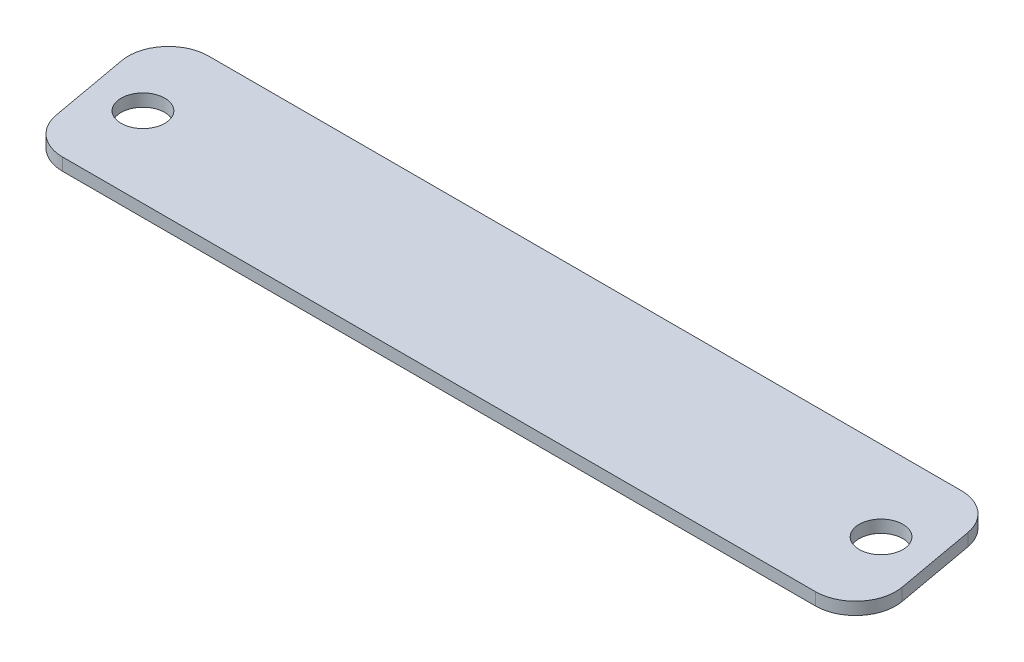
ISO-10303-21;
HEADER;
FILE_DESCRIPTION(('STEP AP214'),'2;1');
FILE_NAME('part.step','',(''),(''),'','','');
FILE_SCHEMA(('AUTOMOTIVE_DESIGN { 1 0 10303 214 1 1 1 1 }'));
ENDSEC;
DATA;
#1=APPLICATION_CONTEXT('core data for automotive mechanical design processes');
#2=APPLICATION_PROTOCOL_DEFINITION('international standard','automotive_design',2000,#1);
#3=PRODUCT_CONTEXT('',#1,'mechanical');
#4=PRODUCT('Part','Part','',(#3));
#5=PRODUCT_RELATED_PRODUCT_CATEGORY('part','',(#4));
#6=PRODUCT_DEFINITION_FORMATION('','',#4);
#7=PRODUCT_DEFINITION_CONTEXT('part definition',#1,'design');
#8=PRODUCT_DEFINITION('design','',#6,#7);
#9=PRODUCT_DEFINITION_SHAPE('','',#8);
#10=(LENGTH_UNIT() NAMED_UNIT(*) SI_UNIT(.MILLI.,.METRE.));
#11=(NAMED_UNIT(*) PLANE_ANGLE_UNIT() SI_UNIT($,.RADIAN.));
#12=(NAMED_UNIT(*) SI_UNIT($,.STERADIAN.) SOLID_ANGLE_UNIT());
#13=UNCERTAINTY_MEASURE_WITH_UNIT(LENGTH_MEASURE(1.E-05),#10,'distance_accuracy_value','');
#14=(GEOMETRIC_REPRESENTATION_CONTEXT(3) GLOBAL_UNCERTAINTY_ASSIGNED_CONTEXT((#13)) GLOBAL_UNIT_ASSIGNED_CONTEXT((#10,
#11,#12)) REPRESENTATION_CONTEXT('',''));
#15=CARTESIAN_POINT('',(0.,0.,0.));
#16=DIRECTION('',(0.,0.,1.));
#17=DIRECTION('',(1.,0.,0.));
#18=AXIS2_PLACEMENT_3D('',#15,#16,#17);
#19=CARTESIAN_POINT('',(0.,-0.7874,-10.16));
#20=DIRECTION('',(0.,0.,-1.));
#21=DIRECTION('',(-1.,0.,0.));
#22=AXIS2_PLACEMENT_3D('',#19,#20,#21);
#23=PLANE('',#22);
#24=DIRECTION('',(-1.,0.,0.));
#25=VECTOR('',#24,1.);
#26=CARTESIAN_POINT('',(0.,-0.7874,-10.16));
#27=LINE('',#26,#25);
#28=CARTESIAN_POINT('',(52.8025370439333,-0.7874,-10.16));
#29=VERTEX_POINT('',#28);
#30=CARTESIAN_POINT('',(5.12509129932392,-0.7874,-10.16));
#31=VERTEX_POINT('',#30);
#32=EDGE_CURVE('E113',#29,#31,#27,.T.);
#33=ORIENTED_EDGE('',*,*,#32,.T.);
#34=DIRECTION('',(0.,-1.,0.));
#35=VECTOR('',#34,1.);
#36=CARTESIAN_POINT('',(5.12509129932392,-0.7874,-10.16));
#37=LINE('',#36,#35);
#38=CARTESIAN_POINT('',(5.12509129932392,0.,-10.16));
#39=VERTEX_POINT('',#38);
#40=EDGE_CURVE('E126',#31,#39,#37,.F.);
#41=ORIENTED_EDGE('',*,*,#40,.T.);
#42=DIRECTION('',(-1.,0.,0.));
#43=VECTOR('',#42,1.);
#44=CARTESIAN_POINT('',(0.,0.,-10.16));
#45=LINE('',#44,#43);
#46=CARTESIAN_POINT('',(52.8025370439333,0.,-10.16));
#47=VERTEX_POINT('',#46);
#48=EDGE_CURVE('E138',#47,#39,#45,.T.);
#49=ORIENTED_EDGE('',*,*,#48,.F.);
#50=DIRECTION('',(0.,-1.,0.));
#51=VECTOR('',#50,1.);
#52=CARTESIAN_POINT('',(52.8025370439333,-0.7874,-10.16));
#53=LINE('',#52,#51);
#54=EDGE_CURVE('E128',#47,#29,#53,.T.);
#55=ORIENTED_EDGE('',*,*,#54,.T.);
#56=EDGE_LOOP('',(#33,#41,#49,#55));
#57=FACE_BOUND('',#56,.T.);
#58=ADVANCED_FACE('F35',(#57),#23,.T.);
#59=CARTESIAN_POINT('',(0.,-0.7874,0.));
#60=DIRECTION('',(0.,0.,1.));
#61=DIRECTION('',(1.,0.,0.));
#62=AXIS2_PLACEMENT_3D('',#59,#60,#61);
#63=PLANE('',#62);
#64=DIRECTION('',(1.,0.,0.));
#65=VECTOR('',#64,1.);
#66=CARTESIAN_POINT('',(0.,0.,0.));
#67=LINE('',#66,#65);
#68=CARTESIAN_POINT('',(6.04156747323697,0.,0.));
#69=VERTEX_POINT('',#68);
#70=CARTESIAN_POINT('',(53.7190132178463,0.,0.));
#71=VERTEX_POINT('',#70);
#72=EDGE_CURVE('E146',#69,#71,#67,.T.);
#73=ORIENTED_EDGE('',*,*,#72,.F.);
#74=DIRECTION('',(0.,-1.,0.));
#75=VECTOR('',#74,1.);
#76=CARTESIAN_POINT('',(6.04156747323697,-0.7874,0.));
#77=LINE('',#76,#75);
#78=CARTESIAN_POINT('',(6.04156747323697,-0.7874,0.));
#79=VERTEX_POINT('',#78);
#80=EDGE_CURVE('E165',#69,#79,#77,.T.);
#81=ORIENTED_EDGE('',*,*,#80,.T.);
#82=DIRECTION('',(1.,0.,0.));
#83=VECTOR('',#82,1.);
#84=CARTESIAN_POINT('',(0.,-0.7874,0.));
#85=LINE('',#84,#83);
#86=CARTESIAN_POINT('',(53.7190132178463,-0.7874,0.));
#87=VERTEX_POINT('',#86);
#88=EDGE_CURVE('E145',#79,#87,#85,.T.);
#89=ORIENTED_EDGE('',*,*,#88,.T.);
#90=DIRECTION('',(0.,-1.,0.));
#91=VECTOR('',#90,1.);
#92=CARTESIAN_POINT('',(53.7190132178463,-0.7874,0.));
#93=LINE('',#92,#91);
#94=EDGE_CURVE('E162',#87,#71,#93,.F.);
#95=ORIENTED_EDGE('',*,*,#94,.T.);
#96=EDGE_LOOP('',(#73,#81,#89,#95));
#97=FACE_BOUND('',#96,.T.);
#98=ADVANCED_FACE('F172',(#97),#63,.T.);
#99=CARTESIAN_POINT('',(0.,-0.7874,0.));
#100=DIRECTION('',(0.,-1.,0.));
#101=DIRECTION('',(0.,0.,-1.));
#102=AXIS2_PLACEMENT_3D('',#99,#100,#101);
#103=PLANE('',#102);
#104=CARTESIAN_POINT('',(6.05075532495308,-0.7874,-5.08000000000005));
#105=DIRECTION('',(0.,-1.,0.));
#106=DIRECTION('',(0.,0.,-1.));
#107=AXIS2_PLACEMENT_3D('',#104,#105,#106);
#108=CIRCLE('',#107,1.3843);
#109=CARTESIAN_POINT('',(6.05075532495308,-0.7874,-6.46430000000005));
#110=VERTEX_POINT('',#109);
#111=EDGE_CURVE('E179',#110,#110,#108,.T.);
#112=ORIENTED_EDGE('',*,*,#111,.F.);
#113=EDGE_LOOP('',(#112));
#114=FACE_BOUND('',#113,.T.);
#115=CARTESIAN_POINT('',(52.7933491922172,-0.7874,-5.0800000000001));
#116=DIRECTION('',(0.,-1.,0.));
#117=DIRECTION('',(0.,0.,-1.));
#118=AXIS2_PLACEMENT_3D('',#115,#116,#117);
#119=CIRCLE('',#118,1.3843);
#120=CARTESIAN_POINT('',(52.7933491922172,-0.7874,-6.46430000000009));
#121=VERTEX_POINT('',#120);
#122=EDGE_CURVE('E184',#121,#121,#119,.T.);
#123=ORIENTED_EDGE('',*,*,#122,.F.);
#124=EDGE_LOOP('',(#123));
#125=FACE_BOUND('',#124,.T.);
#126=ORIENTED_EDGE('',*,*,#88,.F.);
#127=CARTESIAN_POINT('',(6.04156747323697,-0.7874,-2.54));
#128=DIRECTION('',(0.,-1.,0.));
#129=DIRECTION('',(0.,0.,-1.));
#130=AXIS2_PLACEMENT_3D('',#127,#128,#129);
#131=CIRCLE('',#130,2.54);
#132=CARTESIAN_POINT('',(3.54192014232947,-0.7874,-2.08904188544054));
#133=VERTEX_POINT('',#132);
#134=EDGE_CURVE('E120',#79,#133,#131,.T.);
#135=ORIENTED_EDGE('',*,*,#134,.T.);
#136=DIRECTION('',(0.17754256478719,0.,0.984113122404527));
#137=VECTOR('',#136,1.);
#138=CARTESIAN_POINT('',(2.08584911621846,-0.7874,-10.16));
#139=LINE('',#138,#137);
#140=CARTESIAN_POINT('',(2.62544396841642,-0.7874,-7.16904188544054));
#141=VERTEX_POINT('',#140);
#142=EDGE_CURVE('E106',#141,#133,#139,.T.);
#143=ORIENTED_EDGE('',*,*,#142,.F.);
#144=CARTESIAN_POINT('',(5.12509129932392,-0.7874,-7.62));
#145=DIRECTION('',(0.,-1.,0.));
#146=DIRECTION('',(0.,0.,-1.));
#147=AXIS2_PLACEMENT_3D('',#144,#145,#146);
#148=CIRCLE('',#147,2.54);
#149=EDGE_CURVE('E117',#141,#31,#148,.T.);
#150=ORIENTED_EDGE('',*,*,#149,.T.);
#151=ORIENTED_EDGE('',*,*,#32,.F.);
#152=CARTESIAN_POINT('',(52.8025370439333,-0.7874,-7.62));
#153=DIRECTION('',(0.,-1.,0.));
#154=DIRECTION('',(0.,0.,-1.));
#155=AXIS2_PLACEMENT_3D('',#152,#153,#154);
#156=CIRCLE('',#155,2.54);
#157=CARTESIAN_POINT('',(55.3021843748408,-0.7874,-8.07095811455947));
#158=VERTEX_POINT('',#157);
#159=EDGE_CURVE('E50',#29,#158,#156,.T.);
#160=ORIENTED_EDGE('',*,*,#159,.T.);
#161=DIRECTION('',(-0.17754256478719,0.,-0.984113122404527));
#162=VECTOR('',#161,1.);
#163=CARTESIAN_POINT('',(56.7582554009518,-0.7874,0.));
#164=LINE('',#163,#162);
#165=CARTESIAN_POINT('',(56.2186605487538,-0.7874,-2.99095811455946));
#166=VERTEX_POINT('',#165);
#167=EDGE_CURVE('E167',#166,#158,#164,.T.);
#168=ORIENTED_EDGE('',*,*,#167,.F.);
#169=CARTESIAN_POINT('',(53.7190132178463,-0.7874,-2.54));
#170=DIRECTION('',(0.,-1.,0.));
#171=DIRECTION('',(0.,0.,-1.));
#172=AXIS2_PLACEMENT_3D('',#169,#170,#171);
#173=CIRCLE('',#172,2.54);
#174=EDGE_CURVE('E130',#166,#87,#173,.T.);
#175=ORIENTED_EDGE('',*,*,#174,.T.);
#176=EDGE_LOOP('',(#126,#135,#143,#150,#151,#160,#168,#175));
#177=FACE_BOUND('',#176,.T.);
#178=ADVANCED_FACE('F116',(#114,#125,#177),#103,.T.);
#179=CARTESIAN_POINT('',(0.,0.,0.));
#180=DIRECTION('',(0.,-1.,0.));
#181=DIRECTION('',(0.,0.,-1.));
#182=AXIS2_PLACEMENT_3D('',#179,#180,#181);
#183=PLANE('',#182);
#184=CARTESIAN_POINT('',(6.05075532495308,0.,-5.08000000000005));
#185=DIRECTION('',(0.,-1.,0.));
#186=DIRECTION('',(0.,0.,-1.));
#187=AXIS2_PLACEMENT_3D('',#184,#185,#186);
#188=CIRCLE('',#187,1.3843);
#189=CARTESIAN_POINT('',(6.05075532495308,0.,-6.46430000000005));
#190=VERTEX_POINT('',#189);
#191=EDGE_CURVE('E181',#190,#190,#188,.T.);
#192=ORIENTED_EDGE('',*,*,#191,.T.);
#193=EDGE_LOOP('',(#192));
#194=FACE_BOUND('',#193,.T.);
#195=CARTESIAN_POINT('',(52.7933491922172,0.,-5.0800000000001));
#196=DIRECTION('',(0.,-1.,0.));
#197=DIRECTION('',(0.,0.,-1.));
#198=AXIS2_PLACEMENT_3D('',#195,#196,#197);
#199=CIRCLE('',#198,1.3843);
#200=CARTESIAN_POINT('',(52.7933491922172,0.,-6.46430000000009));
#201=VERTEX_POINT('',#200);
#202=EDGE_CURVE('E151',#201,#201,#199,.T.);
#203=ORIENTED_EDGE('',*,*,#202,.T.);
#204=EDGE_LOOP('',(#203));
#205=FACE_BOUND('',#204,.T.);
#206=DIRECTION('',(0.17754256478719,0.,0.984113122404527));
#207=VECTOR('',#206,1.);
#208=CARTESIAN_POINT('',(2.08584911621846,0.,-10.16));
#209=LINE('',#208,#207);
#210=CARTESIAN_POINT('',(2.62544396841642,0.,-7.16904188544054));
#211=VERTEX_POINT('',#210);
#212=CARTESIAN_POINT('',(3.54192014232947,0.,-2.08904188544054));
#213=VERTEX_POINT('',#212);
#214=EDGE_CURVE('E109',#211,#213,#209,.T.);
#215=ORIENTED_EDGE('',*,*,#214,.T.);
#216=CARTESIAN_POINT('',(6.04156747323697,0.,-2.54));
#217=DIRECTION('',(0.,-1.,0.));
#218=DIRECTION('',(0.,0.,-1.));
#219=AXIS2_PLACEMENT_3D('',#216,#217,#218);
#220=CIRCLE('',#219,2.54);
#221=EDGE_CURVE('E160',#213,#69,#220,.F.);
#222=ORIENTED_EDGE('',*,*,#221,.T.);
#223=ORIENTED_EDGE('',*,*,#72,.T.);
#224=CARTESIAN_POINT('',(53.7190132178463,0.,-2.54));
#225=DIRECTION('',(0.,-1.,0.));
#226=DIRECTION('',(0.,0.,-1.));
#227=AXIS2_PLACEMENT_3D('',#224,#225,#226);
#228=CIRCLE('',#227,2.54);
#229=CARTESIAN_POINT('',(56.2186605487538,0.,-2.99095811455946));
#230=VERTEX_POINT('',#229);
#231=EDGE_CURVE('E156',#71,#230,#228,.F.);
#232=ORIENTED_EDGE('',*,*,#231,.T.);
#233=DIRECTION('',(-0.17754256478719,0.,-0.984113122404527));
#234=VECTOR('',#233,1.);
#235=CARTESIAN_POINT('',(56.7582554009518,0.,0.));
#236=LINE('',#235,#234);
#237=CARTESIAN_POINT('',(55.3021843748408,0.,-8.07095811455947));
#238=VERTEX_POINT('',#237);
#239=EDGE_CURVE('E121',#230,#238,#236,.T.);
#240=ORIENTED_EDGE('',*,*,#239,.T.);
#241=CARTESIAN_POINT('',(52.8025370439333,0.,-7.62));
#242=DIRECTION('',(0.,-1.,0.));
#243=DIRECTION('',(0.,0.,-1.));
#244=AXIS2_PLACEMENT_3D('',#241,#242,#243);
#245=CIRCLE('',#244,2.54);
#246=EDGE_CURVE('E144',#238,#47,#245,.F.);
#247=ORIENTED_EDGE('',*,*,#246,.T.);
#248=ORIENTED_EDGE('',*,*,#48,.T.);
#249=CARTESIAN_POINT('',(5.12509129932392,0.,-7.62));
#250=DIRECTION('',(0.,-1.,0.));
#251=DIRECTION('',(0.,0.,-1.));
#252=AXIS2_PLACEMENT_3D('',#249,#250,#251);
#253=CIRCLE('',#252,2.54);
#254=EDGE_CURVE('E142',#39,#211,#253,.F.);
#255=ORIENTED_EDGE('',*,*,#254,.T.);
#256=EDGE_LOOP('',(#215,#222,#223,#232,#240,#247,#248,#255));
#257=FACE_BOUND('',#256,.T.);
#258=ADVANCED_FACE('F141',(#194,#205,#257),#183,.F.);
#259=CARTESIAN_POINT('',(52.7933491922172,0.,-5.0800000000001));
#260=DIRECTION('',(0.,-1.,0.));
#261=DIRECTION('',(0.,0.,-1.));
#262=AXIS2_PLACEMENT_3D('',#259,#260,#261);
#263=CYLINDRICAL_SURFACE('',#262,1.3843);
#264=ORIENTED_EDGE('',*,*,#202,.F.);
#265=EDGE_LOOP('',(#264));
#266=FACE_BOUND('',#265,.T.);
#267=ORIENTED_EDGE('',*,*,#122,.T.);
#268=EDGE_LOOP('',(#267));
#269=FACE_BOUND('',#268,.T.);
#270=ADVANCED_FACE('F192',(#266,#269),#263,.F.);
#271=CARTESIAN_POINT('',(6.05075532495308,0.,-5.08000000000005));
#272=DIRECTION('',(0.,-1.,0.));
#273=DIRECTION('',(0.,0.,-1.));
#274=AXIS2_PLACEMENT_3D('',#271,#272,#273);
#275=CYLINDRICAL_SURFACE('',#274,1.3843);
#276=ORIENTED_EDGE('',*,*,#191,.F.);
#277=EDGE_LOOP('',(#276));
#278=FACE_BOUND('',#277,.T.);
#279=ORIENTED_EDGE('',*,*,#111,.T.);
#280=EDGE_LOOP('',(#279));
#281=FACE_BOUND('',#280,.T.);
#282=ADVANCED_FACE('F258',(#278,#281),#275,.F.);
#283=CARTESIAN_POINT('',(2.08584911621846,-0.7874,-10.16));
#284=DIRECTION('',(0.984113122404527,0.,-0.17754256478719));
#285=DIRECTION('',(0.17754256478719,0.,0.984113122404527));
#286=AXIS2_PLACEMENT_3D('',#283,#284,#285);
#287=PLANE('',#286);
#288=ORIENTED_EDGE('',*,*,#142,.T.);
#289=DIRECTION('',(0.,1.,0.));
#290=VECTOR('',#289,1.);
#291=CARTESIAN_POINT('',(3.54192014232947,-0.7874,-2.08904188544054));
#292=LINE('',#291,#290);
#293=EDGE_CURVE('E112',#133,#213,#292,.T.);
#294=ORIENTED_EDGE('',*,*,#293,.T.);
#295=ORIENTED_EDGE('',*,*,#214,.F.);
#296=DIRECTION('',(0.,1.,0.));
#297=VECTOR('',#296,1.);
#298=CARTESIAN_POINT('',(2.62544396841642,-0.7874,-7.16904188544054));
#299=LINE('',#298,#297);
#300=EDGE_CURVE('E102',#211,#141,#299,.F.);
#301=ORIENTED_EDGE('',*,*,#300,.T.);
#302=EDGE_LOOP('',(#288,#294,#295,#301));
#303=FACE_BOUND('',#302,.T.);
#304=ADVANCED_FACE('F104',(#303),#287,.F.);
#305=CARTESIAN_POINT('',(56.7582554009518,-0.7874,0.));
#306=DIRECTION('',(-0.984113122404527,0.,0.17754256478719));
#307=DIRECTION('',(-0.17754256478719,0.,-0.984113122404527));
#308=AXIS2_PLACEMENT_3D('',#305,#306,#307);
#309=PLANE('',#308);
#310=ORIENTED_EDGE('',*,*,#167,.T.);
#311=DIRECTION('',(0.,1.,0.));
#312=VECTOR('',#311,1.);
#313=CARTESIAN_POINT('',(55.3021843748408,-0.7874,-8.07095811455947));
#314=LINE('',#313,#312);
#315=EDGE_CURVE('E11',#158,#238,#314,.T.);
#316=ORIENTED_EDGE('',*,*,#315,.T.);
#317=ORIENTED_EDGE('',*,*,#239,.F.);
#318=DIRECTION('',(0.,1.,0.));
#319=VECTOR('',#318,1.);
#320=CARTESIAN_POINT('',(56.2186605487538,-0.7874,-2.99095811455946));
#321=LINE('',#320,#319);
#322=EDGE_CURVE('E43',#230,#166,#321,.F.);
#323=ORIENTED_EDGE('',*,*,#322,.T.);
#324=EDGE_LOOP('',(#310,#316,#317,#323));
#325=FACE_BOUND('',#324,.T.);
#326=ADVANCED_FACE('F174',(#325),#309,.F.);
#327=CARTESIAN_POINT('',(6.04156747323697,-0.7874,-2.54));
#328=DIRECTION('',(0.,-1.,0.));
#329=DIRECTION('',(0.,0.,-1.));
#330=AXIS2_PLACEMENT_3D('',#327,#328,#329);
#331=CYLINDRICAL_SURFACE('',#330,2.54);
#332=ORIENTED_EDGE('',*,*,#134,.F.);
#333=ORIENTED_EDGE('',*,*,#80,.F.);
#334=ORIENTED_EDGE('',*,*,#221,.F.);
#335=ORIENTED_EDGE('',*,*,#293,.F.);
#336=EDGE_LOOP('',(#332,#333,#334,#335));
#337=FACE_BOUND('',#336,.T.);
#338=ADVANCED_FACE('F211',(#337),#331,.T.);
#339=CARTESIAN_POINT('',(5.12509129932392,-0.7874,-7.62));
#340=DIRECTION('',(0.,-1.,0.));
#341=DIRECTION('',(0.,0.,-1.));
#342=AXIS2_PLACEMENT_3D('',#339,#340,#341);
#343=CYLINDRICAL_SURFACE('',#342,2.54);
#344=ORIENTED_EDGE('',*,*,#149,.F.);
#345=ORIENTED_EDGE('',*,*,#300,.F.);
#346=ORIENTED_EDGE('',*,*,#254,.F.);
#347=ORIENTED_EDGE('',*,*,#40,.F.);
#348=EDGE_LOOP('',(#344,#345,#346,#347));
#349=FACE_BOUND('',#348,.T.);
#350=ADVANCED_FACE('F124',(#349),#343,.T.);
#351=CARTESIAN_POINT('',(52.8025370439333,-0.7874,-7.62));
#352=DIRECTION('',(0.,-1.,0.));
#353=DIRECTION('',(0.,0.,-1.));
#354=AXIS2_PLACEMENT_3D('',#351,#352,#353);
#355=CYLINDRICAL_SURFACE('',#354,2.54);
#356=ORIENTED_EDGE('',*,*,#159,.F.);
#357=ORIENTED_EDGE('',*,*,#54,.F.);
#358=ORIENTED_EDGE('',*,*,#246,.F.);
#359=ORIENTED_EDGE('',*,*,#315,.F.);
#360=EDGE_LOOP('',(#356,#357,#358,#359));
#361=FACE_BOUND('',#360,.T.);
#362=ADVANCED_FACE('F216',(#361),#355,.T.);
#363=CARTESIAN_POINT('',(53.7190132178463,-0.7874,-2.54));
#364=DIRECTION('',(0.,-1.,0.));
#365=DIRECTION('',(0.,0.,-1.));
#366=AXIS2_PLACEMENT_3D('',#363,#364,#365);
#367=CYLINDRICAL_SURFACE('',#366,2.54);
#368=ORIENTED_EDGE('',*,*,#174,.F.);
#369=ORIENTED_EDGE('',*,*,#322,.F.);
#370=ORIENTED_EDGE('',*,*,#231,.F.);
#371=ORIENTED_EDGE('',*,*,#94,.F.);
#372=EDGE_LOOP('',(#368,#369,#370,#371));
#373=FACE_BOUND('',#372,.T.);
#374=ADVANCED_FACE('F37',(#373),#367,.T.);
#375=CLOSED_SHELL('',(#58,#98,#178,#258,#270,#282,#304,#326,#338,#350,#362,#374));
#376=MANIFOLD_SOLID_BREP('B2',#375);
#377=ADVANCED_BREP_SHAPE_REPRESENTATION('',(#18,#376),#14);
#378=SHAPE_DEFINITION_REPRESENTATION(#9,#377);
ENDSEC;
END-ISO-10303-21;
